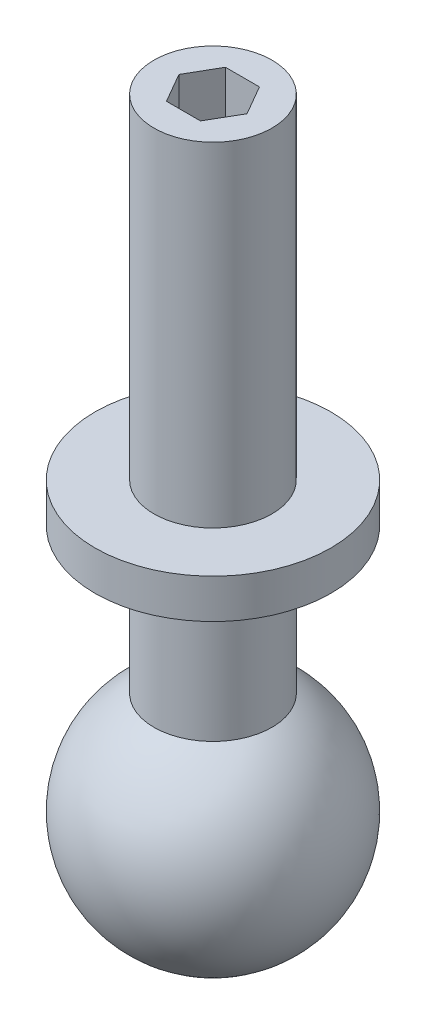
ISO-10303-21;
HEADER;
FILE_DESCRIPTION(('STEP AP214'),'2;1');
FILE_NAME('part.step','',(''),(''),'','','');
FILE_SCHEMA(('AUTOMOTIVE_DESIGN { 1 0 10303 214 1 1 1 1 }'));
ENDSEC;
DATA;
#1=APPLICATION_CONTEXT('core data for automotive mechanical design processes');
#2=APPLICATION_PROTOCOL_DEFINITION('international standard','automotive_design',2000,#1);
#3=PRODUCT_CONTEXT('',#1,'mechanical');
#4=PRODUCT('Part','Part','',(#3));
#5=PRODUCT_RELATED_PRODUCT_CATEGORY('part','',(#4));
#6=PRODUCT_DEFINITION_FORMATION('','',#4);
#7=PRODUCT_DEFINITION_CONTEXT('part definition',#1,'design');
#8=PRODUCT_DEFINITION('design','',#6,#7);
#9=PRODUCT_DEFINITION_SHAPE('','',#8);
#10=(LENGTH_UNIT() NAMED_UNIT(*) SI_UNIT(.MILLI.,.METRE.));
#11=(NAMED_UNIT(*) PLANE_ANGLE_UNIT() SI_UNIT($,.RADIAN.));
#12=(NAMED_UNIT(*) SI_UNIT($,.STERADIAN.) SOLID_ANGLE_UNIT());
#13=UNCERTAINTY_MEASURE_WITH_UNIT(LENGTH_MEASURE(1.E-05),#10,'distance_accuracy_value','');
#14=(GEOMETRIC_REPRESENTATION_CONTEXT(3) GLOBAL_UNCERTAINTY_ASSIGNED_CONTEXT((#13)) GLOBAL_UNIT_ASSIGNED_CONTEXT((#10,
#11,#12)) REPRESENTATION_CONTEXT('',''));
#15=CARTESIAN_POINT('',(0.,0.,0.));
#16=DIRECTION('',(0.,0.,1.));
#17=DIRECTION('',(1.,0.,0.));
#18=AXIS2_PLACEMENT_3D('',#15,#16,#17);
#19=CARTESIAN_POINT('',(-23.3826859021798,105.8,-19.));
#20=DIRECTION('',(0.,1.,0.));
#21=DIRECTION('',(0.,0.,-1.));
#22=AXIS2_PLACEMENT_3D('',#19,#20,#21);
#23=PLANE('',#22);
#24=CARTESIAN_POINT('',(-23.3826859021798,105.8,-19.));
#25=DIRECTION('',(0.,-1.,0.));
#26=DIRECTION('',(0.,0.,-1.));
#27=AXIS2_PLACEMENT_3D('',#24,#25,#26);
#28=CIRCLE('',#27,1.5);
#29=CARTESIAN_POINT('',(-23.3826859021798,105.8,-20.5));
#30=VERTEX_POINT('',#29);
#31=EDGE_CURVE('E121',#30,#30,#28,.T.);
#32=ORIENTED_EDGE('',*,*,#31,.F.);
#33=EDGE_LOOP('',(#32));
#34=FACE_BOUND('',#33,.T.);
#35=DIRECTION('',(1.,0.,0.));
#36=VECTOR('',#35,1.);
#37=CARTESIAN_POINT('',(-23.3826859021798,105.8,-18.25));
#38=LINE('',#37,#36);
#39=CARTESIAN_POINT('',(-23.8156986040721,105.8,-18.25));
#40=VERTEX_POINT('',#39);
#41=CARTESIAN_POINT('',(-22.9496732002876,105.8,-18.25));
#42=VERTEX_POINT('',#41);
#43=EDGE_CURVE('E128',#40,#42,#38,.T.);
#44=ORIENTED_EDGE('',*,*,#43,.F.);
#45=DIRECTION('',(0.499999999999996,0.,0.866025403784441));
#46=VECTOR('',#45,1.);
#47=CARTESIAN_POINT('',(-24.0322049550182,105.8,-18.625));
#48=LINE('',#47,#46);
#49=CARTESIAN_POINT('',(-24.2487113059643,105.8,-19.));
#50=VERTEX_POINT('',#49);
#51=EDGE_CURVE('E131',#50,#40,#48,.T.);
#52=ORIENTED_EDGE('',*,*,#51,.F.);
#53=DIRECTION('',(-0.499999999999996,0.,0.866025403784441));
#54=VECTOR('',#53,1.);
#55=CARTESIAN_POINT('',(-24.0322049550182,105.8,-19.375));
#56=LINE('',#55,#54);
#57=CARTESIAN_POINT('',(-23.8156986040721,105.8,-19.75));
#58=VERTEX_POINT('',#57);
#59=EDGE_CURVE('E137',#58,#50,#56,.T.);
#60=ORIENTED_EDGE('',*,*,#59,.F.);
#61=DIRECTION('',(-1.,0.,0.));
#62=VECTOR('',#61,1.);
#63=CARTESIAN_POINT('',(-23.3826859021798,105.8,-19.75));
#64=LINE('',#63,#62);
#65=CARTESIAN_POINT('',(-22.9496732002876,105.8,-19.75));
#66=VERTEX_POINT('',#65);
#67=EDGE_CURVE('E143',#66,#58,#64,.T.);
#68=ORIENTED_EDGE('',*,*,#67,.F.);
#69=DIRECTION('',(-0.499999999999998,0.,-0.86602540378444));
#70=VECTOR('',#69,1.);
#71=CARTESIAN_POINT('',(-22.7331668493415,105.8,-19.375));
#72=LINE('',#71,#70);
#73=CARTESIAN_POINT('',(-22.5166604983954,105.8,-19.));
#74=VERTEX_POINT('',#73);
#75=EDGE_CURVE('E47',#74,#66,#72,.T.);
#76=ORIENTED_EDGE('',*,*,#75,.F.);
#77=DIRECTION('',(0.499999999999998,0.,-0.86602540378444));
#78=VECTOR('',#77,1.);
#79=CARTESIAN_POINT('',(-22.7331668493415,105.8,-18.625));
#80=LINE('',#79,#78);
#81=EDGE_CURVE('E11',#42,#74,#80,.T.);
#82=ORIENTED_EDGE('',*,*,#81,.F.);
#83=EDGE_LOOP('',(#44,#52,#60,#68,#76,#82));
#84=FACE_BOUND('',#83,.T.);
#85=ADVANCED_FACE('F41',(#34,#84),#23,.T.);
#86=CARTESIAN_POINT('',(-23.3826859021798,105.8,-19.));
#87=DIRECTION('',(0.,-1.,0.));
#88=DIRECTION('',(0.,0.,1.));
#89=AXIS2_PLACEMENT_3D('',#86,#87,#88);
#90=CYLINDRICAL_SURFACE('',#89,1.5);
#91=CARTESIAN_POINT('',(-23.3826859021798,97.3,-19.));
#92=DIRECTION('',(0.,-1.,0.));
#93=DIRECTION('',(0.,0.,-1.));
#94=AXIS2_PLACEMENT_3D('',#91,#92,#93);
#95=CIRCLE('',#94,1.5);
#96=CARTESIAN_POINT('',(-23.3826859021798,97.3,-20.5));
#97=VERTEX_POINT('',#96);
#98=EDGE_CURVE('E119',#97,#97,#95,.T.);
#99=ORIENTED_EDGE('',*,*,#98,.F.);
#100=EDGE_LOOP('',(#99));
#101=FACE_BOUND('',#100,.T.);
#102=ORIENTED_EDGE('',*,*,#31,.T.);
#103=EDGE_LOOP('',(#102));
#104=FACE_BOUND('',#103,.T.);
#105=ADVANCED_FACE('F43',(#101,#104),#90,.T.);
#106=CARTESIAN_POINT('',(-23.3826859021798,97.3,-19.));
#107=DIRECTION('',(0.,-1.,0.));
#108=DIRECTION('',(0.,0.,1.));
#109=AXIS2_PLACEMENT_3D('',#106,#107,#108);
#110=CYLINDRICAL_SURFACE('',#109,3.);
#111=CARTESIAN_POINT('',(-23.3826859021798,97.3,-19.));
#112=DIRECTION('',(0.,-1.,0.));
#113=DIRECTION('',(0.,0.,-1.));
#114=AXIS2_PLACEMENT_3D('',#111,#112,#113);
#115=CIRCLE('',#114,3.);
#116=CARTESIAN_POINT('',(-23.3826859021798,97.3,-22.));
#117=VERTEX_POINT('',#116);
#118=EDGE_CURVE('E115',#117,#117,#115,.T.);
#119=ORIENTED_EDGE('',*,*,#118,.T.);
#120=EDGE_LOOP('',(#119));
#121=FACE_BOUND('',#120,.T.);
#122=CARTESIAN_POINT('',(-23.3826859021798,96.3,-19.));
#123=DIRECTION('',(0.,-1.,0.));
#124=DIRECTION('',(0.,0.,-1.));
#125=AXIS2_PLACEMENT_3D('',#122,#123,#124);
#126=CIRCLE('',#125,3.);
#127=CARTESIAN_POINT('',(-23.3826859021798,96.3,-22.));
#128=VERTEX_POINT('',#127);
#129=EDGE_CURVE('E108',#128,#128,#126,.T.);
#130=ORIENTED_EDGE('',*,*,#129,.F.);
#131=EDGE_LOOP('',(#130));
#132=FACE_BOUND('',#131,.T.);
#133=ADVANCED_FACE('F184',(#121,#132),#110,.T.);
#134=CARTESIAN_POINT('',(-23.3826859021798,97.3,-19.));
#135=DIRECTION('',(0.,1.,0.));
#136=DIRECTION('',(0.,0.,-1.));
#137=AXIS2_PLACEMENT_3D('',#134,#135,#136);
#138=PLANE('',#137);
#139=ORIENTED_EDGE('',*,*,#98,.T.);
#140=EDGE_LOOP('',(#139));
#141=FACE_BOUND('',#140,.T.);
#142=ORIENTED_EDGE('',*,*,#118,.F.);
#143=EDGE_LOOP('',(#142));
#144=FACE_BOUND('',#143,.T.);
#145=ADVANCED_FACE('F198',(#141,#144),#138,.T.);
#146=CARTESIAN_POINT('',(-23.3826859021798,96.3,-19.));
#147=DIRECTION('',(0.,1.,0.));
#148=DIRECTION('',(0.,0.,-1.));
#149=AXIS2_PLACEMENT_3D('',#146,#147,#148);
#150=PLANE('',#149);
#151=CARTESIAN_POINT('',(-23.3826859021798,96.3,-19.));
#152=DIRECTION('',(0.,-1.,0.));
#153=DIRECTION('',(0.,0.,-1.));
#154=AXIS2_PLACEMENT_3D('',#151,#152,#153);
#155=CIRCLE('',#154,1.5);
#156=CARTESIAN_POINT('',(-23.3826859021798,96.3,-20.5));
#157=VERTEX_POINT('',#156);
#158=EDGE_CURVE('E123',#157,#157,#155,.T.);
#159=ORIENTED_EDGE('',*,*,#158,.F.);
#160=EDGE_LOOP('',(#159));
#161=FACE_BOUND('',#160,.T.);
#162=ORIENTED_EDGE('',*,*,#129,.T.);
#163=EDGE_LOOP('',(#162));
#164=FACE_BOUND('',#163,.T.);
#165=ADVANCED_FACE('F195',(#161,#164),#150,.F.);
#166=CARTESIAN_POINT('',(-23.3826859021798,90.,-19.));
#167=DIRECTION('',(0.,0.,-1.));
#168=DIRECTION('',(-1.,0.,0.));
#169=AXIS2_PLACEMENT_3D('',#166,#167,#168);
#170=SPHERICAL_SURFACE('',#169,3.);
#171=CARTESIAN_POINT('',(-23.3826859021798,90.,-19.));
#172=DIRECTION('',(0.,1.,0.));
#173=DIRECTION('',(0.,0.,1.));
#174=AXIS2_PLACEMENT_3D('',#171,#172,#173);
#175=SPHERICAL_SURFACE('',#174,3.);
#176=CARTESIAN_POINT('',(-23.3826859021798,92.5980762113533,-19.));
#177=DIRECTION('',(0.,1.,0.));
#178=DIRECTION('',(0.,0.,1.));
#179=AXIS2_PLACEMENT_3D('',#176,#177,#178);
#180=CIRCLE('',#179,1.5);
#181=CARTESIAN_POINT('',(-23.3826859021798,92.5980762113533,-17.5));
#182=VERTEX_POINT('',#181);
#183=EDGE_CURVE('E124',#182,#182,#180,.F.);
#184=ORIENTED_EDGE('',*,*,#183,.T.);
#185=EDGE_LOOP('',(#184));
#186=FACE_BOUND('',#185,.T.);
#187=ADVANCED_FACE('F189',(#186),#175,.T.);
#188=ORIENTED_EDGE('',*,*,#183,.F.);
#189=EDGE_LOOP('',(#188));
#190=FACE_BOUND('',#189,.T.);
#191=ORIENTED_EDGE('',*,*,#158,.T.);
#192=EDGE_LOOP('',(#191));
#193=FACE_BOUND('',#192,.T.);
#194=ADVANCED_FACE('F187',(#190,#193),#90,.T.);
#195=CARTESIAN_POINT('',(-22.9496732002876,104.3,-18.25));
#196=DIRECTION('',(-0.86602540378444,0.,-0.499999999999998));
#197=DIRECTION('',(-0.499999999999998,0.,0.86602540378444));
#198=AXIS2_PLACEMENT_3D('',#195,#196,#197);
#199=PLANE('',#198);
#200=DIRECTION('',(0.,1.,0.));
#201=VECTOR('',#200,1.);
#202=CARTESIAN_POINT('',(-22.9496732002876,104.3,-18.25));
#203=LINE('',#202,#201);
#204=CARTESIAN_POINT('',(-22.9496732002876,104.3,-18.25));
#205=VERTEX_POINT('',#204);
#206=EDGE_CURVE('E54',#205,#42,#203,.T.);
#207=ORIENTED_EDGE('',*,*,#206,.T.);
#208=ORIENTED_EDGE('',*,*,#81,.T.);
#209=DIRECTION('',(0.,1.,0.));
#210=VECTOR('',#209,1.);
#211=CARTESIAN_POINT('',(-22.5166604983954,104.3,-19.));
#212=LINE('',#211,#210);
#213=CARTESIAN_POINT('',(-22.5166604983954,104.3,-19.));
#214=VERTEX_POINT('',#213);
#215=EDGE_CURVE('E63',#214,#74,#212,.T.);
#216=ORIENTED_EDGE('',*,*,#215,.F.);
#217=DIRECTION('',(0.499999999999998,0.,-0.866025403784439));
#218=VECTOR('',#217,1.);
#219=CARTESIAN_POINT('',(-22.9496732002876,104.3,-18.25));
#220=LINE('',#219,#218);
#221=EDGE_CURVE('E101',#205,#214,#220,.T.);
#222=ORIENTED_EDGE('',*,*,#221,.F.);
#223=EDGE_LOOP('',(#207,#208,#216,#222));
#224=FACE_BOUND('',#223,.T.);
#225=ADVANCED_FACE('F110',(#224),#199,.T.);
#226=CARTESIAN_POINT('',(-22.5166604983954,104.3,-19.));
#227=DIRECTION('',(-0.86602540378444,0.,0.499999999999998));
#228=DIRECTION('',(0.499999999999998,0.,0.86602540378444));
#229=AXIS2_PLACEMENT_3D('',#226,#227,#228);
#230=PLANE('',#229);
#231=ORIENTED_EDGE('',*,*,#215,.T.);
#232=ORIENTED_EDGE('',*,*,#75,.T.);
#233=DIRECTION('',(0.,1.,0.));
#234=VECTOR('',#233,1.);
#235=CARTESIAN_POINT('',(-22.9496732002876,104.3,-19.75));
#236=LINE('',#235,#234);
#237=CARTESIAN_POINT('',(-22.9496732002876,104.3,-19.75));
#238=VERTEX_POINT('',#237);
#239=EDGE_CURVE('E100',#238,#66,#236,.T.);
#240=ORIENTED_EDGE('',*,*,#239,.F.);
#241=DIRECTION('',(-0.499999999999998,0.,-0.866025403784439));
#242=VECTOR('',#241,1.);
#243=CARTESIAN_POINT('',(-22.5166604983954,104.3,-19.));
#244=LINE('',#243,#242);
#245=EDGE_CURVE('E94',#214,#238,#244,.T.);
#246=ORIENTED_EDGE('',*,*,#245,.F.);
#247=EDGE_LOOP('',(#231,#232,#240,#246));
#248=FACE_BOUND('',#247,.T.);
#249=ADVANCED_FACE('F96',(#248),#230,.T.);
#250=CARTESIAN_POINT('',(-22.9496732002876,104.3,-19.75));
#251=DIRECTION('',(0.,0.,1.));
#252=DIRECTION('',(1.,0.,0.));
#253=AXIS2_PLACEMENT_3D('',#250,#251,#252);
#254=PLANE('',#253);
#255=ORIENTED_EDGE('',*,*,#239,.T.);
#256=ORIENTED_EDGE('',*,*,#67,.T.);
#257=DIRECTION('',(0.,1.,0.));
#258=VECTOR('',#257,1.);
#259=CARTESIAN_POINT('',(-23.8156986040721,104.3,-19.75));
#260=LINE('',#259,#258);
#261=CARTESIAN_POINT('',(-23.8156986040721,104.3,-19.75));
#262=VERTEX_POINT('',#261);
#263=EDGE_CURVE('E111',#262,#58,#260,.T.);
#264=ORIENTED_EDGE('',*,*,#263,.F.);
#265=DIRECTION('',(-1.,0.,0.));
#266=VECTOR('',#265,1.);
#267=CARTESIAN_POINT('',(-22.9496732002876,104.3,-19.75));
#268=LINE('',#267,#266);
#269=EDGE_CURVE('E99',#238,#262,#268,.T.);
#270=ORIENTED_EDGE('',*,*,#269,.F.);
#271=EDGE_LOOP('',(#255,#256,#264,#270));
#272=FACE_BOUND('',#271,.T.);
#273=ADVANCED_FACE('F147',(#272),#254,.T.);
#274=CARTESIAN_POINT('',(-23.8156986040721,104.3,-19.75));
#275=DIRECTION('',(0.866025403784441,0.,0.499999999999995));
#276=DIRECTION('',(0.499999999999996,0.,-0.866025403784441));
#277=AXIS2_PLACEMENT_3D('',#274,#275,#276);
#278=PLANE('',#277);
#279=ORIENTED_EDGE('',*,*,#263,.T.);
#280=ORIENTED_EDGE('',*,*,#59,.T.);
#281=DIRECTION('',(0.,1.,0.));
#282=VECTOR('',#281,1.);
#283=CARTESIAN_POINT('',(-24.2487113059643,104.3,-19.));
#284=LINE('',#283,#282);
#285=CARTESIAN_POINT('',(-24.2487113059643,104.3,-19.));
#286=VERTEX_POINT('',#285);
#287=EDGE_CURVE('E165',#286,#50,#284,.T.);
#288=ORIENTED_EDGE('',*,*,#287,.F.);
#289=DIRECTION('',(-0.499999999999996,0.,0.866025403784441));
#290=VECTOR('',#289,1.);
#291=CARTESIAN_POINT('',(-23.8156986040721,104.3,-19.75));
#292=LINE('',#291,#290);
#293=EDGE_CURVE('E155',#262,#286,#292,.T.);
#294=ORIENTED_EDGE('',*,*,#293,.F.);
#295=EDGE_LOOP('',(#279,#280,#288,#294));
#296=FACE_BOUND('',#295,.T.);
#297=ADVANCED_FACE('F163',(#296),#278,.T.);
#298=CARTESIAN_POINT('',(-24.2487113059643,104.3,-19.));
#299=DIRECTION('',(0.866025403784441,0.,-0.499999999999995));
#300=DIRECTION('',(-0.499999999999996,0.,-0.866025403784441));
#301=AXIS2_PLACEMENT_3D('',#298,#299,#300);
#302=PLANE('',#301);
#303=ORIENTED_EDGE('',*,*,#287,.T.);
#304=ORIENTED_EDGE('',*,*,#51,.T.);
#305=DIRECTION('',(0.,1.,0.));
#306=VECTOR('',#305,1.);
#307=CARTESIAN_POINT('',(-23.8156986040721,104.3,-18.25));
#308=LINE('',#307,#306);
#309=CARTESIAN_POINT('',(-23.8156986040721,104.3,-18.25));
#310=VERTEX_POINT('',#309);
#311=EDGE_CURVE('E159',#310,#40,#308,.T.);
#312=ORIENTED_EDGE('',*,*,#311,.F.);
#313=DIRECTION('',(0.499999999999996,0.,0.866025403784441));
#314=VECTOR('',#313,1.);
#315=CARTESIAN_POINT('',(-24.2487113059643,104.3,-19.));
#316=LINE('',#315,#314);
#317=EDGE_CURVE('E152',#286,#310,#316,.T.);
#318=ORIENTED_EDGE('',*,*,#317,.F.);
#319=EDGE_LOOP('',(#303,#304,#312,#318));
#320=FACE_BOUND('',#319,.T.);
#321=ADVANCED_FACE('F169',(#320),#302,.T.);
#322=CARTESIAN_POINT('',(-23.8156986040721,104.3,-18.25));
#323=DIRECTION('',(0.,0.,-1.));
#324=DIRECTION('',(-1.,0.,0.));
#325=AXIS2_PLACEMENT_3D('',#322,#323,#324);
#326=PLANE('',#325);
#327=ORIENTED_EDGE('',*,*,#311,.T.);
#328=ORIENTED_EDGE('',*,*,#43,.T.);
#329=ORIENTED_EDGE('',*,*,#206,.F.);
#330=DIRECTION('',(1.,0.,0.));
#331=VECTOR('',#330,1.);
#332=CARTESIAN_POINT('',(-23.8156986040721,104.3,-18.25));
#333=LINE('',#332,#331);
#334=EDGE_CURVE('E104',#310,#205,#333,.T.);
#335=ORIENTED_EDGE('',*,*,#334,.F.);
#336=EDGE_LOOP('',(#327,#328,#329,#335));
#337=FACE_BOUND('',#336,.T.);
#338=ADVANCED_FACE('F168',(#337),#326,.T.);
#339=CARTESIAN_POINT('',(0.,104.3,0.));
#340=DIRECTION('',(0.,-1.,0.));
#341=DIRECTION('',(0.,0.,1.));
#342=AXIS2_PLACEMENT_3D('',#339,#340,#341);
#343=PLANE('',#342);
#344=ORIENTED_EDGE('',*,*,#221,.T.);
#345=ORIENTED_EDGE('',*,*,#245,.T.);
#346=ORIENTED_EDGE('',*,*,#269,.T.);
#347=ORIENTED_EDGE('',*,*,#293,.T.);
#348=ORIENTED_EDGE('',*,*,#317,.T.);
#349=ORIENTED_EDGE('',*,*,#334,.T.);
#350=EDGE_LOOP('',(#344,#345,#346,#347,#348,#349));
#351=FACE_BOUND('',#350,.T.);
#352=ADVANCED_FACE('F103',(#351),#343,.F.);
#353=CLOSED_SHELL('',(#85,#105,#133,#145,#165,#187,#194,#225,#249,#273,#297,#321,#338,#352));
#354=MANIFOLD_SOLID_BREP('B2',#353);
#355=ADVANCED_BREP_SHAPE_REPRESENTATION('',(#18,#354),#14);
#356=SHAPE_DEFINITION_REPRESENTATION(#9,#355);
ENDSEC;
END-ISO-10303-21;
